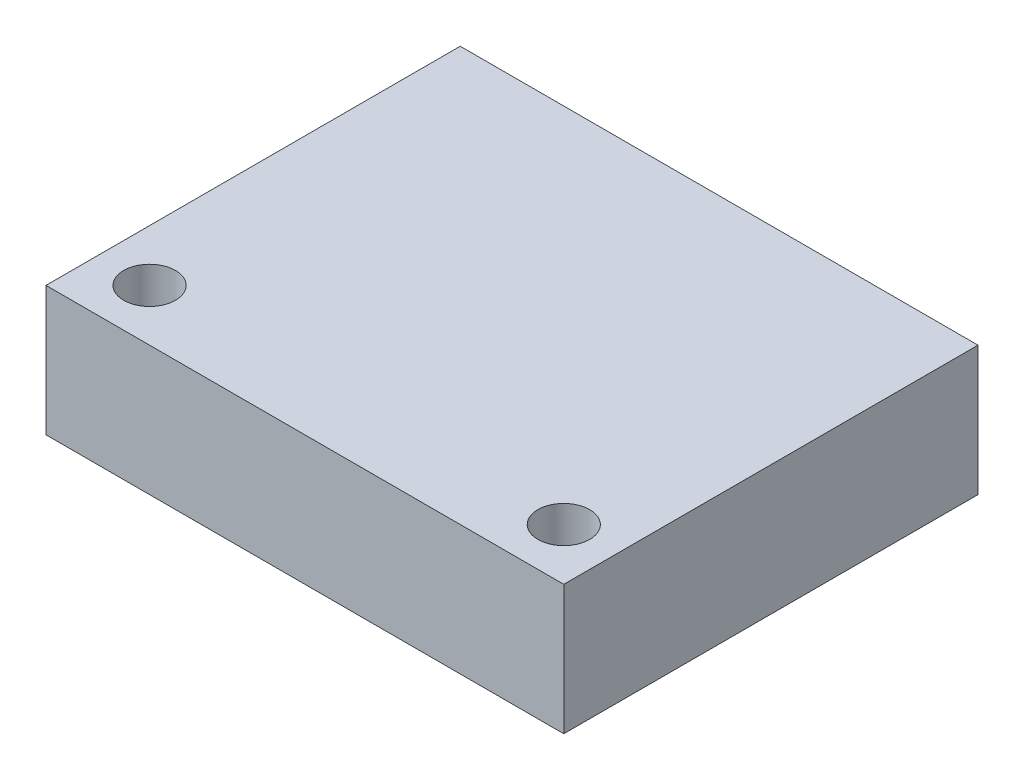
ISO-10303-21;
HEADER;
FILE_DESCRIPTION(('STEP AP214'),'2;1');
FILE_NAME('part.step','',(''),(''),'','','');
FILE_SCHEMA(('AUTOMOTIVE_DESIGN { 1 0 10303 214 1 1 1 1 }'));
ENDSEC;
DATA;
#1=APPLICATION_CONTEXT('core data for automotive mechanical design processes');
#2=APPLICATION_PROTOCOL_DEFINITION('international standard','automotive_design',2000,#1);
#3=PRODUCT_CONTEXT('',#1,'mechanical');
#4=PRODUCT('Part','Part','',(#3));
#5=PRODUCT_RELATED_PRODUCT_CATEGORY('part','',(#4));
#6=PRODUCT_DEFINITION_FORMATION('','',#4);
#7=PRODUCT_DEFINITION_CONTEXT('part definition',#1,'design');
#8=PRODUCT_DEFINITION('design','',#6,#7);
#9=PRODUCT_DEFINITION_SHAPE('','',#8);
#10=(LENGTH_UNIT() NAMED_UNIT(*) SI_UNIT(.MILLI.,.METRE.));
#11=(NAMED_UNIT(*) PLANE_ANGLE_UNIT() SI_UNIT($,.RADIAN.));
#12=(NAMED_UNIT(*) SI_UNIT($,.STERADIAN.) SOLID_ANGLE_UNIT());
#13=UNCERTAINTY_MEASURE_WITH_UNIT(LENGTH_MEASURE(1.E-05),#10,'distance_accuracy_value','');
#14=(GEOMETRIC_REPRESENTATION_CONTEXT(3) GLOBAL_UNCERTAINTY_ASSIGNED_CONTEXT((#13)) GLOBAL_UNIT_ASSIGNED_CONTEXT((#10,
#11,#12)) REPRESENTATION_CONTEXT('',''));
#15=CARTESIAN_POINT('',(0.,0.,0.));
#16=DIRECTION('',(0.,0.,1.));
#17=DIRECTION('',(1.,0.,0.));
#18=AXIS2_PLACEMENT_3D('',#15,#16,#17);
#19=CARTESIAN_POINT('',(10.,5.,8.));
#20=DIRECTION('',(-1.,0.,0.));
#21=DIRECTION('',(0.,0.,1.));
#22=AXIS2_PLACEMENT_3D('',#19,#20,#21);
#23=PLANE('',#22);
#24=DIRECTION('',(0.,0.,-1.));
#25=VECTOR('',#24,1.);
#26=CARTESIAN_POINT('',(10.,0.,8.));
#27=LINE('',#26,#25);
#28=CARTESIAN_POINT('',(10.,0.,8.));
#29=VERTEX_POINT('',#28);
#30=CARTESIAN_POINT('',(10.,0.,-8.));
#31=VERTEX_POINT('',#30);
#32=EDGE_CURVE('E99',#29,#31,#27,.T.);
#33=ORIENTED_EDGE('',*,*,#32,.T.);
#34=DIRECTION('',(0.,-1.,0.));
#35=VECTOR('',#34,1.);
#36=CARTESIAN_POINT('',(10.,5.,-8.));
#37=LINE('',#36,#35);
#38=CARTESIAN_POINT('',(10.,5.,-8.));
#39=VERTEX_POINT('',#38);
#40=EDGE_CURVE('E11',#39,#31,#37,.T.);
#41=ORIENTED_EDGE('',*,*,#40,.F.);
#42=DIRECTION('',(0.,0.,-1.));
#43=VECTOR('',#42,1.);
#44=CARTESIAN_POINT('',(10.,5.,8.));
#45=LINE('',#44,#43);
#46=CARTESIAN_POINT('',(10.,5.,8.));
#47=VERTEX_POINT('',#46);
#48=EDGE_CURVE('E87',#47,#39,#45,.T.);
#49=ORIENTED_EDGE('',*,*,#48,.F.);
#50=DIRECTION('',(0.,-1.,0.));
#51=VECTOR('',#50,1.);
#52=CARTESIAN_POINT('',(10.,5.,8.));
#53=LINE('',#52,#51);
#54=EDGE_CURVE('E95',#47,#29,#53,.T.);
#55=ORIENTED_EDGE('',*,*,#54,.T.);
#56=EDGE_LOOP('',(#33,#41,#49,#55));
#57=FACE_BOUND('',#56,.T.);
#58=ADVANCED_FACE('F36',(#57),#23,.F.);
#59=CARTESIAN_POINT('',(-10.,5.,-8.));
#60=DIRECTION('',(0.,0.,1.));
#61=DIRECTION('',(1.,0.,0.));
#62=AXIS2_PLACEMENT_3D('',#59,#60,#61);
#63=PLANE('',#62);
#64=DIRECTION('',(-1.,0.,0.));
#65=VECTOR('',#64,1.);
#66=CARTESIAN_POINT('',(-10.,0.,-8.));
#67=LINE('',#66,#65);
#68=CARTESIAN_POINT('',(-10.,0.,-8.));
#69=VERTEX_POINT('',#68);
#70=EDGE_CURVE('E91',#31,#69,#67,.T.);
#71=ORIENTED_EDGE('',*,*,#70,.T.);
#72=DIRECTION('',(0.,-1.,0.));
#73=VECTOR('',#72,1.);
#74=CARTESIAN_POINT('',(-10.,5.,-8.));
#75=LINE('',#74,#73);
#76=CARTESIAN_POINT('',(-10.,5.,-8.));
#77=VERTEX_POINT('',#76);
#78=EDGE_CURVE('E44',#77,#69,#75,.T.);
#79=ORIENTED_EDGE('',*,*,#78,.F.);
#80=DIRECTION('',(-1.,0.,0.));
#81=VECTOR('',#80,1.);
#82=CARTESIAN_POINT('',(-10.,5.,-8.));
#83=LINE('',#82,#81);
#84=EDGE_CURVE('E82',#39,#77,#83,.T.);
#85=ORIENTED_EDGE('',*,*,#84,.F.);
#86=ORIENTED_EDGE('',*,*,#40,.T.);
#87=EDGE_LOOP('',(#71,#79,#85,#86));
#88=FACE_BOUND('',#87,.T.);
#89=ADVANCED_FACE('F90',(#88),#63,.F.);
#90=CARTESIAN_POINT('',(-10.,5.,8.));
#91=DIRECTION('',(1.,0.,0.));
#92=DIRECTION('',(0.,0.,-1.));
#93=AXIS2_PLACEMENT_3D('',#90,#91,#92);
#94=PLANE('',#93);
#95=DIRECTION('',(0.,0.,1.));
#96=VECTOR('',#95,1.);
#97=CARTESIAN_POINT('',(-10.,0.,8.));
#98=LINE('',#97,#96);
#99=CARTESIAN_POINT('',(-10.,0.,8.));
#100=VERTEX_POINT('',#99);
#101=EDGE_CURVE('E69',#69,#100,#98,.T.);
#102=ORIENTED_EDGE('',*,*,#101,.T.);
#103=DIRECTION('',(0.,-1.,0.));
#104=VECTOR('',#103,1.);
#105=CARTESIAN_POINT('',(-10.,5.,8.));
#106=LINE('',#105,#104);
#107=CARTESIAN_POINT('',(-10.,5.,8.));
#108=VERTEX_POINT('',#107);
#109=EDGE_CURVE('E92',#108,#100,#106,.T.);
#110=ORIENTED_EDGE('',*,*,#109,.F.);
#111=DIRECTION('',(0.,0.,1.));
#112=VECTOR('',#111,1.);
#113=CARTESIAN_POINT('',(-10.,5.,8.));
#114=LINE('',#113,#112);
#115=EDGE_CURVE('E85',#77,#108,#114,.T.);
#116=ORIENTED_EDGE('',*,*,#115,.F.);
#117=ORIENTED_EDGE('',*,*,#78,.T.);
#118=EDGE_LOOP('',(#102,#110,#116,#117));
#119=FACE_BOUND('',#118,.T.);
#120=ADVANCED_FACE('F93',(#119),#94,.F.);
#121=CARTESIAN_POINT('',(-10.,5.,8.));
#122=DIRECTION('',(0.,0.,-1.));
#123=DIRECTION('',(-1.,0.,0.));
#124=AXIS2_PLACEMENT_3D('',#121,#122,#123);
#125=PLANE('',#124);
#126=DIRECTION('',(1.,0.,0.));
#127=VECTOR('',#126,1.);
#128=CARTESIAN_POINT('',(-10.,0.,8.));
#129=LINE('',#128,#127);
#130=EDGE_CURVE('E75',#100,#29,#129,.T.);
#131=ORIENTED_EDGE('',*,*,#130,.T.);
#132=ORIENTED_EDGE('',*,*,#54,.F.);
#133=DIRECTION('',(1.,0.,0.));
#134=VECTOR('',#133,1.);
#135=CARTESIAN_POINT('',(-10.,5.,8.));
#136=LINE('',#135,#134);
#137=EDGE_CURVE('E52',#108,#47,#136,.T.);
#138=ORIENTED_EDGE('',*,*,#137,.F.);
#139=ORIENTED_EDGE('',*,*,#109,.T.);
#140=EDGE_LOOP('',(#131,#132,#138,#139));
#141=FACE_BOUND('',#140,.T.);
#142=ADVANCED_FACE('F107',(#141),#125,.F.);
#143=CARTESIAN_POINT('',(0.,5.,0.));
#144=DIRECTION('',(0.,-1.,0.));
#145=DIRECTION('',(0.,0.,-1.));
#146=AXIS2_PLACEMENT_3D('',#143,#144,#145);
#147=PLANE('',#146);
#148=CARTESIAN_POINT('',(-8.,5.,6.));
#149=DIRECTION('',(0.,1.,0.));
#150=DIRECTION('',(0.,0.,1.));
#151=AXIS2_PLACEMENT_3D('',#148,#149,#150);
#152=CIRCLE('',#151,1.);
#153=CARTESIAN_POINT('',(-8.,5.,7.));
#154=VERTEX_POINT('',#153);
#155=EDGE_CURVE('E119',#154,#154,#152,.T.);
#156=ORIENTED_EDGE('',*,*,#155,.F.);
#157=EDGE_LOOP('',(#156));
#158=FACE_BOUND('',#157,.T.);
#159=CARTESIAN_POINT('',(8.,5.,6.));
#160=DIRECTION('',(0.,1.,0.));
#161=DIRECTION('',(0.,0.,1.));
#162=AXIS2_PLACEMENT_3D('',#159,#160,#161);
#163=CIRCLE('',#162,1.);
#164=CARTESIAN_POINT('',(8.,5.,7.));
#165=VERTEX_POINT('',#164);
#166=EDGE_CURVE('E113',#165,#165,#163,.T.);
#167=ORIENTED_EDGE('',*,*,#166,.F.);
#168=EDGE_LOOP('',(#167));
#169=FACE_BOUND('',#168,.T.);
#170=ORIENTED_EDGE('',*,*,#48,.T.);
#171=ORIENTED_EDGE('',*,*,#84,.T.);
#172=ORIENTED_EDGE('',*,*,#115,.T.);
#173=ORIENTED_EDGE('',*,*,#137,.T.);
#174=EDGE_LOOP('',(#170,#171,#172,#173));
#175=FACE_BOUND('',#174,.T.);
#176=ADVANCED_FACE('F83',(#158,#169,#175),#147,.F.);
#177=CARTESIAN_POINT('',(0.,0.,0.));
#178=DIRECTION('',(0.,-1.,0.));
#179=DIRECTION('',(0.,0.,-1.));
#180=AXIS2_PLACEMENT_3D('',#177,#178,#179);
#181=PLANE('',#180);
#182=CARTESIAN_POINT('',(-8.,0.,6.));
#183=DIRECTION('',(0.,1.,0.));
#184=DIRECTION('',(0.,0.,1.));
#185=AXIS2_PLACEMENT_3D('',#182,#183,#184);
#186=CIRCLE('',#185,1.);
#187=CARTESIAN_POINT('',(-8.,0.,7.));
#188=VERTEX_POINT('',#187);
#189=EDGE_CURVE('E102',#188,#188,#186,.T.);
#190=ORIENTED_EDGE('',*,*,#189,.T.);
#191=EDGE_LOOP('',(#190));
#192=FACE_BOUND('',#191,.T.);
#193=CARTESIAN_POINT('',(8.,0.,6.));
#194=DIRECTION('',(0.,1.,0.));
#195=DIRECTION('',(0.,0.,1.));
#196=AXIS2_PLACEMENT_3D('',#193,#194,#195);
#197=CIRCLE('',#196,1.);
#198=CARTESIAN_POINT('',(8.,0.,7.));
#199=VERTEX_POINT('',#198);
#200=EDGE_CURVE('E116',#199,#199,#197,.T.);
#201=ORIENTED_EDGE('',*,*,#200,.T.);
#202=EDGE_LOOP('',(#201));
#203=FACE_BOUND('',#202,.T.);
#204=ORIENTED_EDGE('',*,*,#32,.F.);
#205=ORIENTED_EDGE('',*,*,#130,.F.);
#206=ORIENTED_EDGE('',*,*,#101,.F.);
#207=ORIENTED_EDGE('',*,*,#70,.F.);
#208=EDGE_LOOP('',(#204,#205,#206,#207));
#209=FACE_BOUND('',#208,.T.);
#210=ADVANCED_FACE('F110',(#192,#203,#209),#181,.T.);
#211=CARTESIAN_POINT('',(8.,0.,6.));
#212=DIRECTION('',(0.,1.,0.));
#213=DIRECTION('',(0.,0.,1.));
#214=AXIS2_PLACEMENT_3D('',#211,#212,#213);
#215=CYLINDRICAL_SURFACE('',#214,1.);
#216=ORIENTED_EDGE('',*,*,#200,.F.);
#217=EDGE_LOOP('',(#216));
#218=FACE_BOUND('',#217,.T.);
#219=ORIENTED_EDGE('',*,*,#166,.T.);
#220=EDGE_LOOP('',(#219));
#221=FACE_BOUND('',#220,.T.);
#222=ADVANCED_FACE('F130',(#218,#221),#215,.F.);
#223=CARTESIAN_POINT('',(-8.,0.,6.));
#224=DIRECTION('',(0.,1.,0.));
#225=DIRECTION('',(0.,0.,1.));
#226=AXIS2_PLACEMENT_3D('',#223,#224,#225);
#227=CYLINDRICAL_SURFACE('',#226,1.);
#228=ORIENTED_EDGE('',*,*,#189,.F.);
#229=EDGE_LOOP('',(#228));
#230=FACE_BOUND('',#229,.T.);
#231=ORIENTED_EDGE('',*,*,#155,.T.);
#232=EDGE_LOOP('',(#231));
#233=FACE_BOUND('',#232,.T.);
#234=ADVANCED_FACE('F127',(#230,#233),#227,.F.);
#235=CLOSED_SHELL('',(#58,#89,#120,#142,#176,#210,#222,#234));
#236=MANIFOLD_SOLID_BREP('B2',#235);
#237=ADVANCED_BREP_SHAPE_REPRESENTATION('',(#18,#236),#14);
#238=SHAPE_DEFINITION_REPRESENTATION(#9,#237);
ENDSEC;
END-ISO-10303-21;
